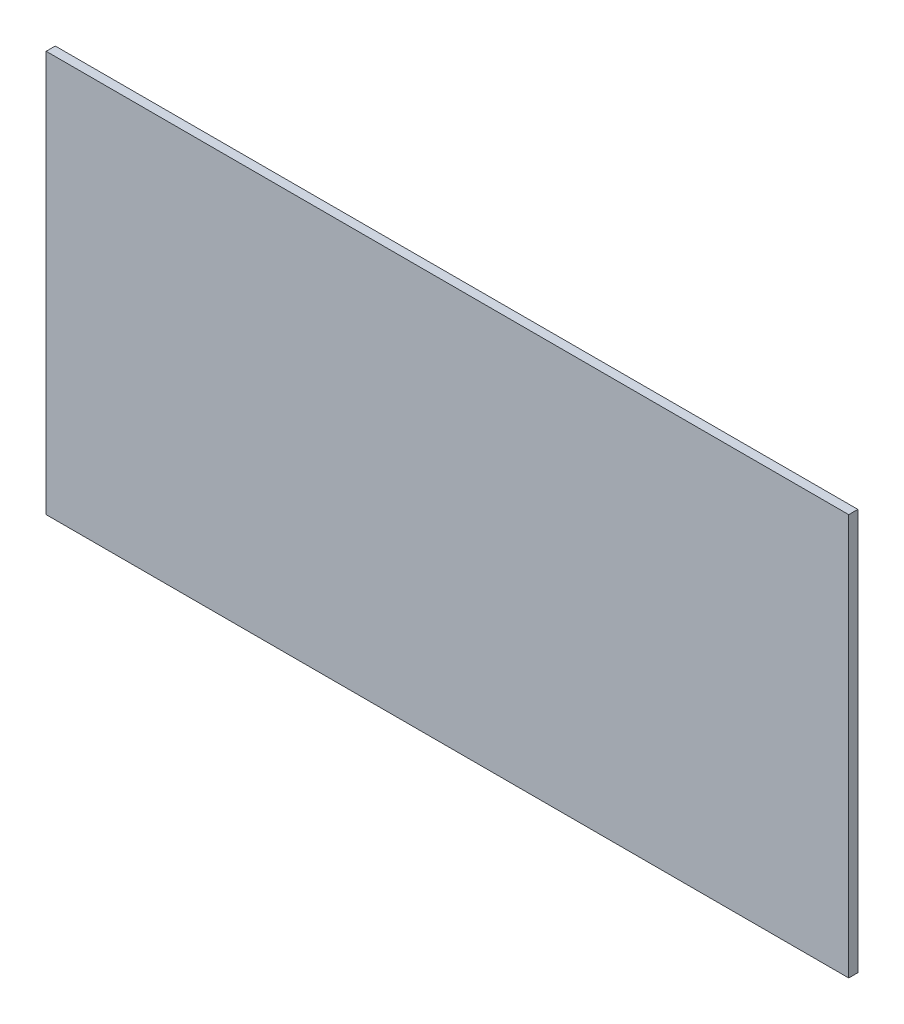
ISO-10303-21;
HEADER;
FILE_DESCRIPTION(('STEP AP214'),'2;1');
FILE_NAME('part.step','',(''),(''),'','','');
FILE_SCHEMA(('AUTOMOTIVE_DESIGN { 1 0 10303 214 1 1 1 1 }'));
ENDSEC;
DATA;
#1=APPLICATION_CONTEXT('core data for automotive mechanical design processes');
#2=APPLICATION_PROTOCOL_DEFINITION('international standard','automotive_design',2000,#1);
#3=PRODUCT_CONTEXT('',#1,'mechanical');
#4=PRODUCT('Part','Part','',(#3));
#5=PRODUCT_RELATED_PRODUCT_CATEGORY('part','',(#4));
#6=PRODUCT_DEFINITION_FORMATION('','',#4);
#7=PRODUCT_DEFINITION_CONTEXT('part definition',#1,'design');
#8=PRODUCT_DEFINITION('design','',#6,#7);
#9=PRODUCT_DEFINITION_SHAPE('','',#8);
#10=(LENGTH_UNIT() NAMED_UNIT(*) SI_UNIT(.MILLI.,.METRE.));
#11=(NAMED_UNIT(*) PLANE_ANGLE_UNIT() SI_UNIT($,.RADIAN.));
#12=(NAMED_UNIT(*) SI_UNIT($,.STERADIAN.) SOLID_ANGLE_UNIT());
#13=UNCERTAINTY_MEASURE_WITH_UNIT(LENGTH_MEASURE(1.E-05),#10,'distance_accuracy_value','');
#14=(GEOMETRIC_REPRESENTATION_CONTEXT(3) GLOBAL_UNCERTAINTY_ASSIGNED_CONTEXT((#13)) GLOBAL_UNIT_ASSIGNED_CONTEXT((#10,
#11,#12)) REPRESENTATION_CONTEXT('',''));
#15=CARTESIAN_POINT('',(0.,0.,0.));
#16=DIRECTION('',(0.,0.,1.));
#17=DIRECTION('',(1.,0.,0.));
#18=AXIS2_PLACEMENT_3D('',#15,#16,#17);
#19=CARTESIAN_POINT('',(220.,-110.,5.));
#20=DIRECTION('',(-1.,0.,0.));
#21=DIRECTION('',(0.,0.,1.));
#22=AXIS2_PLACEMENT_3D('',#19,#20,#21);
#23=PLANE('',#22);
#24=DIRECTION('',(0.,1.,0.));
#25=VECTOR('',#24,1.);
#26=CARTESIAN_POINT('',(220.,-110.,0.));
#27=LINE('',#26,#25);
#28=CARTESIAN_POINT('',(220.,-110.,0.));
#29=VERTEX_POINT('',#28);
#30=CARTESIAN_POINT('',(220.,110.,0.));
#31=VERTEX_POINT('',#30);
#32=EDGE_CURVE('E96',#29,#31,#27,.T.);
#33=ORIENTED_EDGE('',*,*,#32,.T.);
#34=DIRECTION('',(0.,0.,-1.));
#35=VECTOR('',#34,1.);
#36=CARTESIAN_POINT('',(220.,110.,5.));
#37=LINE('',#36,#35);
#38=CARTESIAN_POINT('',(220.,110.,5.));
#39=VERTEX_POINT('',#38);
#40=EDGE_CURVE('E11',#39,#31,#37,.T.);
#41=ORIENTED_EDGE('',*,*,#40,.F.);
#42=DIRECTION('',(0.,1.,0.));
#43=VECTOR('',#42,1.);
#44=CARTESIAN_POINT('',(220.,-110.,5.));
#45=LINE('',#44,#43);
#46=CARTESIAN_POINT('',(220.,-110.,5.));
#47=VERTEX_POINT('',#46);
#48=EDGE_CURVE('E84',#47,#39,#45,.T.);
#49=ORIENTED_EDGE('',*,*,#48,.F.);
#50=DIRECTION('',(0.,0.,-1.));
#51=VECTOR('',#50,1.);
#52=CARTESIAN_POINT('',(220.,-110.,5.));
#53=LINE('',#52,#51);
#54=EDGE_CURVE('E92',#47,#29,#53,.T.);
#55=ORIENTED_EDGE('',*,*,#54,.T.);
#56=EDGE_LOOP('',(#33,#41,#49,#55));
#57=FACE_BOUND('',#56,.T.);
#58=ADVANCED_FACE('F33',(#57),#23,.F.);
#59=CARTESIAN_POINT('',(220.,110.,5.));
#60=DIRECTION('',(0.,-1.,0.));
#61=DIRECTION('',(1.,0.,0.));
#62=AXIS2_PLACEMENT_3D('',#59,#60,#61);
#63=PLANE('',#62);
#64=DIRECTION('',(-1.,0.,0.));
#65=VECTOR('',#64,1.);
#66=CARTESIAN_POINT('',(220.,110.,0.));
#67=LINE('',#66,#65);
#68=CARTESIAN_POINT('',(-220.,110.,0.));
#69=VERTEX_POINT('',#68);
#70=EDGE_CURVE('E88',#31,#69,#67,.T.);
#71=ORIENTED_EDGE('',*,*,#70,.T.);
#72=DIRECTION('',(0.,0.,-1.));
#73=VECTOR('',#72,1.);
#74=CARTESIAN_POINT('',(-220.,110.,5.));
#75=LINE('',#74,#73);
#76=CARTESIAN_POINT('',(-220.,110.,5.));
#77=VERTEX_POINT('',#76);
#78=EDGE_CURVE('E41',#77,#69,#75,.T.);
#79=ORIENTED_EDGE('',*,*,#78,.F.);
#80=DIRECTION('',(-1.,0.,0.));
#81=VECTOR('',#80,1.);
#82=CARTESIAN_POINT('',(220.,110.,5.));
#83=LINE('',#82,#81);
#84=EDGE_CURVE('E79',#39,#77,#83,.T.);
#85=ORIENTED_EDGE('',*,*,#84,.F.);
#86=ORIENTED_EDGE('',*,*,#40,.T.);
#87=EDGE_LOOP('',(#71,#79,#85,#86));
#88=FACE_BOUND('',#87,.T.);
#89=ADVANCED_FACE('F87',(#88),#63,.F.);
#90=CARTESIAN_POINT('',(-220.,110.,5.));
#91=DIRECTION('',(1.,0.,0.));
#92=DIRECTION('',(0.,0.,-1.));
#93=AXIS2_PLACEMENT_3D('',#90,#91,#92);
#94=PLANE('',#93);
#95=DIRECTION('',(0.,-1.,0.));
#96=VECTOR('',#95,1.);
#97=CARTESIAN_POINT('',(-220.,110.,0.));
#98=LINE('',#97,#96);
#99=CARTESIAN_POINT('',(-220.,-110.,0.));
#100=VERTEX_POINT('',#99);
#101=EDGE_CURVE('E66',#69,#100,#98,.T.);
#102=ORIENTED_EDGE('',*,*,#101,.T.);
#103=DIRECTION('',(0.,0.,-1.));
#104=VECTOR('',#103,1.);
#105=CARTESIAN_POINT('',(-220.,-110.,5.));
#106=LINE('',#105,#104);
#107=CARTESIAN_POINT('',(-220.,-110.,5.));
#108=VERTEX_POINT('',#107);
#109=EDGE_CURVE('E89',#108,#100,#106,.T.);
#110=ORIENTED_EDGE('',*,*,#109,.F.);
#111=DIRECTION('',(0.,-1.,0.));
#112=VECTOR('',#111,1.);
#113=CARTESIAN_POINT('',(-220.,110.,5.));
#114=LINE('',#113,#112);
#115=EDGE_CURVE('E82',#77,#108,#114,.T.);
#116=ORIENTED_EDGE('',*,*,#115,.F.);
#117=ORIENTED_EDGE('',*,*,#78,.T.);
#118=EDGE_LOOP('',(#102,#110,#116,#117));
#119=FACE_BOUND('',#118,.T.);
#120=ADVANCED_FACE('F90',(#119),#94,.F.);
#121=CARTESIAN_POINT('',(-220.,-110.,5.));
#122=DIRECTION('',(0.,1.,0.));
#123=DIRECTION('',(-1.,0.,0.));
#124=AXIS2_PLACEMENT_3D('',#121,#122,#123);
#125=PLANE('',#124);
#126=DIRECTION('',(1.,0.,0.));
#127=VECTOR('',#126,1.);
#128=CARTESIAN_POINT('',(-220.,-110.,0.));
#129=LINE('',#128,#127);
#130=EDGE_CURVE('E72',#100,#29,#129,.T.);
#131=ORIENTED_EDGE('',*,*,#130,.T.);
#132=ORIENTED_EDGE('',*,*,#54,.F.);
#133=DIRECTION('',(1.,0.,0.));
#134=VECTOR('',#133,1.);
#135=CARTESIAN_POINT('',(-220.,-110.,5.));
#136=LINE('',#135,#134);
#137=EDGE_CURVE('E49',#108,#47,#136,.T.);
#138=ORIENTED_EDGE('',*,*,#137,.F.);
#139=ORIENTED_EDGE('',*,*,#109,.T.);
#140=EDGE_LOOP('',(#131,#132,#138,#139));
#141=FACE_BOUND('',#140,.T.);
#142=ADVANCED_FACE('F103',(#141),#125,.F.);
#143=CARTESIAN_POINT('',(0.,0.,5.));
#144=DIRECTION('',(0.,0.,1.));
#145=DIRECTION('',(1.,0.,0.));
#146=AXIS2_PLACEMENT_3D('',#143,#144,#145);
#147=PLANE('',#146);
#148=ORIENTED_EDGE('',*,*,#48,.T.);
#149=ORIENTED_EDGE('',*,*,#84,.T.);
#150=ORIENTED_EDGE('',*,*,#115,.T.);
#151=ORIENTED_EDGE('',*,*,#137,.T.);
#152=EDGE_LOOP('',(#148,#149,#150,#151));
#153=FACE_BOUND('',#152,.T.);
#154=ADVANCED_FACE('F80',(#153),#147,.T.);
#155=CARTESIAN_POINT('',(0.,0.,0.));
#156=DIRECTION('',(0.,0.,1.));
#157=DIRECTION('',(1.,0.,0.));
#158=AXIS2_PLACEMENT_3D('',#155,#156,#157);
#159=PLANE('',#158);
#160=ORIENTED_EDGE('',*,*,#32,.F.);
#161=ORIENTED_EDGE('',*,*,#130,.F.);
#162=ORIENTED_EDGE('',*,*,#101,.F.);
#163=ORIENTED_EDGE('',*,*,#70,.F.);
#164=EDGE_LOOP('',(#160,#161,#162,#163));
#165=FACE_BOUND('',#164,.T.);
#166=ADVANCED_FACE('F106',(#165),#159,.F.);
#167=CLOSED_SHELL('',(#58,#89,#120,#142,#154,#166));
#168=MANIFOLD_SOLID_BREP('B2',#167);
#169=ADVANCED_BREP_SHAPE_REPRESENTATION('',(#18,#168),#14);
#170=SHAPE_DEFINITION_REPRESENTATION(#9,#169);
ENDSEC;
END-ISO-10303-21;
